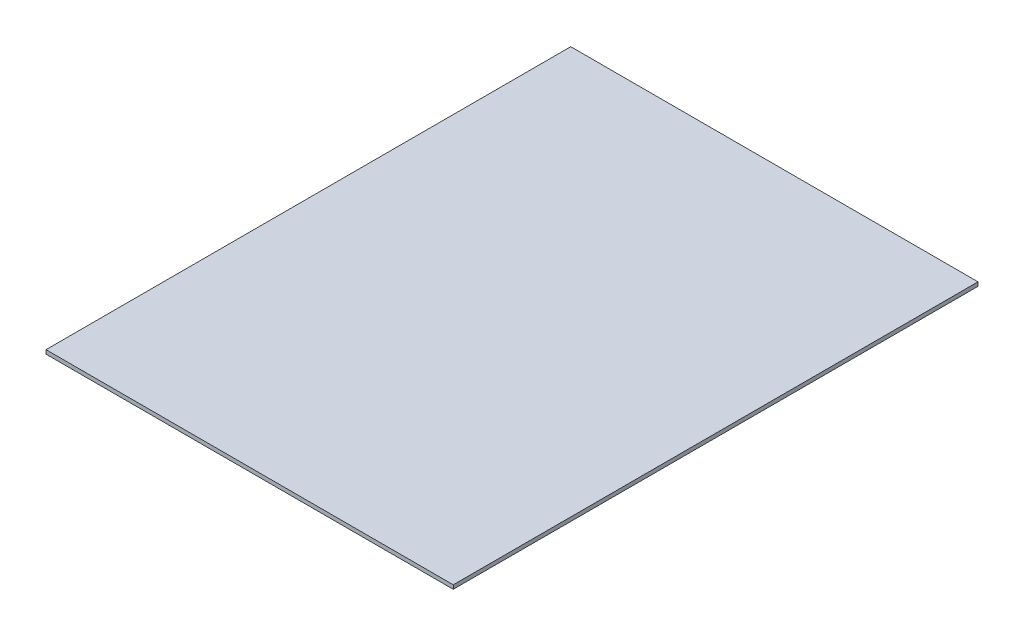
ISO-10303-21;
HEADER;
FILE_DESCRIPTION(('STEP AP214'),'2;1');
FILE_NAME('part.step','',(''),(''),'','','');
FILE_SCHEMA(('AUTOMOTIVE_DESIGN { 1 0 10303 214 1 1 1 1 }'));
ENDSEC;
DATA;
#1=APPLICATION_CONTEXT('core data for automotive mechanical design processes');
#2=APPLICATION_PROTOCOL_DEFINITION('international standard','automotive_design',2000,#1);
#3=PRODUCT_CONTEXT('',#1,'mechanical');
#4=PRODUCT('Part','Part','',(#3));
#5=PRODUCT_RELATED_PRODUCT_CATEGORY('part','',(#4));
#6=PRODUCT_DEFINITION_FORMATION('','',#4);
#7=PRODUCT_DEFINITION_CONTEXT('part definition',#1,'design');
#8=PRODUCT_DEFINITION('design','',#6,#7);
#9=PRODUCT_DEFINITION_SHAPE('','',#8);
#10=(LENGTH_UNIT() NAMED_UNIT(*) SI_UNIT(.MILLI.,.METRE.));
#11=(NAMED_UNIT(*) PLANE_ANGLE_UNIT() SI_UNIT($,.RADIAN.));
#12=(NAMED_UNIT(*) SI_UNIT($,.STERADIAN.) SOLID_ANGLE_UNIT());
#13=UNCERTAINTY_MEASURE_WITH_UNIT(LENGTH_MEASURE(1.E-05),#10,'distance_accuracy_value','');
#14=(GEOMETRIC_REPRESENTATION_CONTEXT(3) GLOBAL_UNCERTAINTY_ASSIGNED_CONTEXT((#13)) GLOBAL_UNIT_ASSIGNED_CONTEXT((#10,
#11,#12)) REPRESENTATION_CONTEXT('',''));
#15=CARTESIAN_POINT('',(0.,0.,0.));
#16=DIRECTION('',(0.,0.,1.));
#17=DIRECTION('',(1.,0.,0.));
#18=AXIS2_PLACEMENT_3D('',#15,#16,#17);
#19=CARTESIAN_POINT('',(260.,5.,-335.));
#20=DIRECTION('',(-1.,0.,0.));
#21=DIRECTION('',(0.,0.,1.));
#22=AXIS2_PLACEMENT_3D('',#19,#20,#21);
#23=PLANE('',#22);
#24=DIRECTION('',(0.,0.,-1.));
#25=VECTOR('',#24,1.);
#26=CARTESIAN_POINT('',(260.,0.,-335.));
#27=LINE('',#26,#25);
#28=CARTESIAN_POINT('',(260.,0.,335.));
#29=VERTEX_POINT('',#28);
#30=CARTESIAN_POINT('',(260.,0.,-335.));
#31=VERTEX_POINT('',#30);
#32=EDGE_CURVE('E98',#29,#31,#27,.T.);
#33=ORIENTED_EDGE('',*,*,#32,.T.);
#34=DIRECTION('',(0.,-1.,0.));
#35=VECTOR('',#34,1.);
#36=CARTESIAN_POINT('',(260.,5.,-335.));
#37=LINE('',#36,#35);
#38=CARTESIAN_POINT('',(260.,5.,-335.));
#39=VERTEX_POINT('',#38);
#40=EDGE_CURVE('E11',#39,#31,#37,.T.);
#41=ORIENTED_EDGE('',*,*,#40,.F.);
#42=DIRECTION('',(0.,0.,-1.));
#43=VECTOR('',#42,1.);
#44=CARTESIAN_POINT('',(260.,5.,-335.));
#45=LINE('',#44,#43);
#46=CARTESIAN_POINT('',(260.,5.,335.));
#47=VERTEX_POINT('',#46);
#48=EDGE_CURVE('E86',#47,#39,#45,.T.);
#49=ORIENTED_EDGE('',*,*,#48,.F.);
#50=DIRECTION('',(0.,-1.,0.));
#51=VECTOR('',#50,1.);
#52=CARTESIAN_POINT('',(260.,5.,335.));
#53=LINE('',#52,#51);
#54=EDGE_CURVE('E94',#47,#29,#53,.T.);
#55=ORIENTED_EDGE('',*,*,#54,.T.);
#56=EDGE_LOOP('',(#33,#41,#49,#55));
#57=FACE_BOUND('',#56,.T.);
#58=ADVANCED_FACE('F35',(#57),#23,.F.);
#59=CARTESIAN_POINT('',(-260.,5.,-335.));
#60=DIRECTION('',(0.,0.,1.));
#61=DIRECTION('',(1.,0.,0.));
#62=AXIS2_PLACEMENT_3D('',#59,#60,#61);
#63=PLANE('',#62);
#64=DIRECTION('',(-1.,0.,0.));
#65=VECTOR('',#64,1.);
#66=CARTESIAN_POINT('',(-260.,0.,-335.));
#67=LINE('',#66,#65);
#68=CARTESIAN_POINT('',(-260.,0.,-335.));
#69=VERTEX_POINT('',#68);
#70=EDGE_CURVE('E90',#31,#69,#67,.T.);
#71=ORIENTED_EDGE('',*,*,#70,.T.);
#72=DIRECTION('',(0.,-1.,0.));
#73=VECTOR('',#72,1.);
#74=CARTESIAN_POINT('',(-260.,5.,-335.));
#75=LINE('',#74,#73);
#76=CARTESIAN_POINT('',(-260.,5.,-335.));
#77=VERTEX_POINT('',#76);
#78=EDGE_CURVE('E43',#77,#69,#75,.T.);
#79=ORIENTED_EDGE('',*,*,#78,.F.);
#80=DIRECTION('',(-1.,0.,0.));
#81=VECTOR('',#80,1.);
#82=CARTESIAN_POINT('',(-260.,5.,-335.));
#83=LINE('',#82,#81);
#84=EDGE_CURVE('E81',#39,#77,#83,.T.);
#85=ORIENTED_EDGE('',*,*,#84,.F.);
#86=ORIENTED_EDGE('',*,*,#40,.T.);
#87=EDGE_LOOP('',(#71,#79,#85,#86));
#88=FACE_BOUND('',#87,.T.);
#89=ADVANCED_FACE('F89',(#88),#63,.F.);
#90=CARTESIAN_POINT('',(-260.,5.,-335.));
#91=DIRECTION('',(1.,0.,0.));
#92=DIRECTION('',(0.,0.,-1.));
#93=AXIS2_PLACEMENT_3D('',#90,#91,#92);
#94=PLANE('',#93);
#95=DIRECTION('',(0.,0.,1.));
#96=VECTOR('',#95,1.);
#97=CARTESIAN_POINT('',(-260.,0.,-335.));
#98=LINE('',#97,#96);
#99=CARTESIAN_POINT('',(-260.,0.,335.));
#100=VERTEX_POINT('',#99);
#101=EDGE_CURVE('E68',#69,#100,#98,.T.);
#102=ORIENTED_EDGE('',*,*,#101,.T.);
#103=DIRECTION('',(0.,-1.,0.));
#104=VECTOR('',#103,1.);
#105=CARTESIAN_POINT('',(-260.,5.,335.));
#106=LINE('',#105,#104);
#107=CARTESIAN_POINT('',(-260.,5.,335.));
#108=VERTEX_POINT('',#107);
#109=EDGE_CURVE('E91',#108,#100,#106,.T.);
#110=ORIENTED_EDGE('',*,*,#109,.F.);
#111=DIRECTION('',(0.,0.,1.));
#112=VECTOR('',#111,1.);
#113=CARTESIAN_POINT('',(-260.,5.,-335.));
#114=LINE('',#113,#112);
#115=EDGE_CURVE('E84',#77,#108,#114,.T.);
#116=ORIENTED_EDGE('',*,*,#115,.F.);
#117=ORIENTED_EDGE('',*,*,#78,.T.);
#118=EDGE_LOOP('',(#102,#110,#116,#117));
#119=FACE_BOUND('',#118,.T.);
#120=ADVANCED_FACE('F92',(#119),#94,.F.);
#121=CARTESIAN_POINT('',(-260.,5.,335.));
#122=DIRECTION('',(0.,0.,-1.));
#123=DIRECTION('',(-1.,0.,0.));
#124=AXIS2_PLACEMENT_3D('',#121,#122,#123);
#125=PLANE('',#124);
#126=DIRECTION('',(1.,0.,0.));
#127=VECTOR('',#126,1.);
#128=CARTESIAN_POINT('',(-260.,0.,335.));
#129=LINE('',#128,#127);
#130=EDGE_CURVE('E74',#100,#29,#129,.T.);
#131=ORIENTED_EDGE('',*,*,#130,.T.);
#132=ORIENTED_EDGE('',*,*,#54,.F.);
#133=DIRECTION('',(1.,0.,0.));
#134=VECTOR('',#133,1.);
#135=CARTESIAN_POINT('',(-260.,5.,335.));
#136=LINE('',#135,#134);
#137=EDGE_CURVE('E51',#108,#47,#136,.T.);
#138=ORIENTED_EDGE('',*,*,#137,.F.);
#139=ORIENTED_EDGE('',*,*,#109,.T.);
#140=EDGE_LOOP('',(#131,#132,#138,#139));
#141=FACE_BOUND('',#140,.T.);
#142=ADVANCED_FACE('F105',(#141),#125,.F.);
#143=CARTESIAN_POINT('',(0.,5.,0.));
#144=DIRECTION('',(0.,1.,0.));
#145=DIRECTION('',(0.,0.,1.));
#146=AXIS2_PLACEMENT_3D('',#143,#144,#145);
#147=PLANE('',#146);
#148=ORIENTED_EDGE('',*,*,#48,.T.);
#149=ORIENTED_EDGE('',*,*,#84,.T.);
#150=ORIENTED_EDGE('',*,*,#115,.T.);
#151=ORIENTED_EDGE('',*,*,#137,.T.);
#152=EDGE_LOOP('',(#148,#149,#150,#151));
#153=FACE_BOUND('',#152,.T.);
#154=ADVANCED_FACE('F82',(#153),#147,.T.);
#155=CARTESIAN_POINT('',(0.,0.,0.));
#156=DIRECTION('',(0.,1.,0.));
#157=DIRECTION('',(0.,0.,1.));
#158=AXIS2_PLACEMENT_3D('',#155,#156,#157);
#159=PLANE('',#158);
#160=ORIENTED_EDGE('',*,*,#32,.F.);
#161=ORIENTED_EDGE('',*,*,#130,.F.);
#162=ORIENTED_EDGE('',*,*,#101,.F.);
#163=ORIENTED_EDGE('',*,*,#70,.F.);
#164=EDGE_LOOP('',(#160,#161,#162,#163));
#165=FACE_BOUND('',#164,.T.);
#166=ADVANCED_FACE('F108',(#165),#159,.F.);
#167=CLOSED_SHELL('',(#58,#89,#120,#142,#154,#166));
#168=MANIFOLD_SOLID_BREP('B2',#167);
#169=ADVANCED_BREP_SHAPE_REPRESENTATION('',(#18,#168),#14);
#170=SHAPE_DEFINITION_REPRESENTATION(#9,#169);
ENDSEC;
END-ISO-10303-21;
